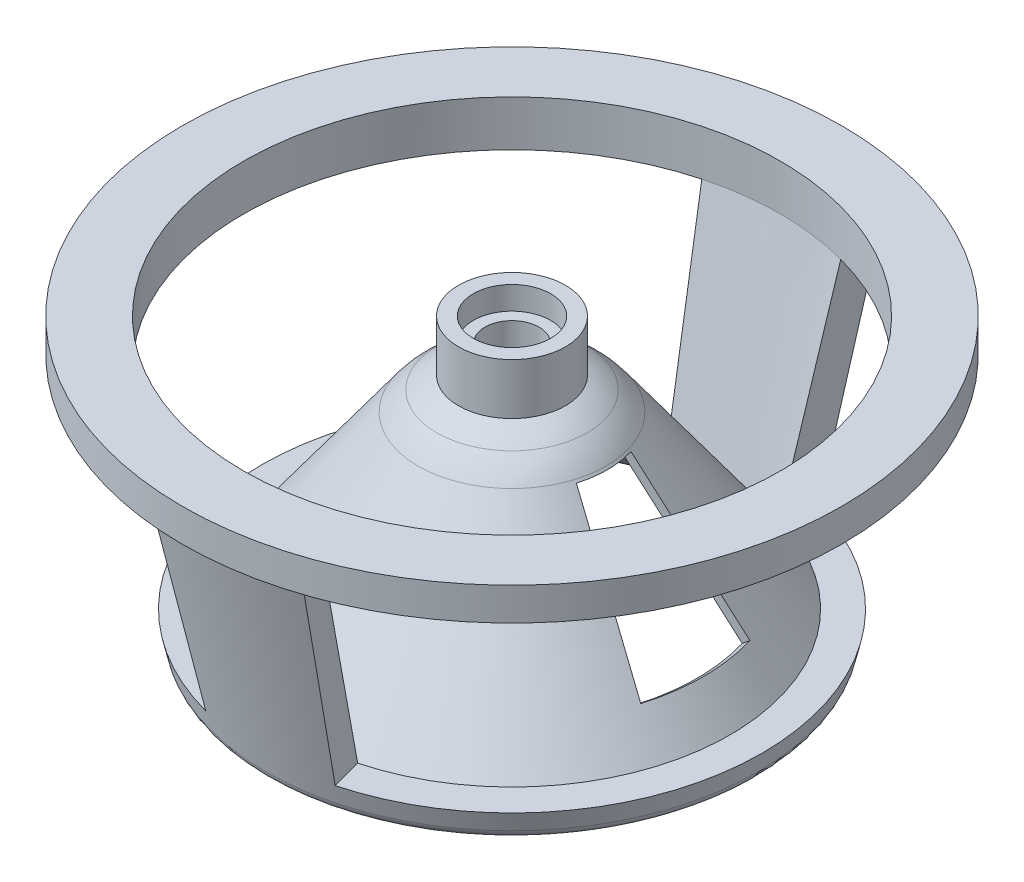
ISO-10303-21;
HEADER;
FILE_DESCRIPTION(('STEP AP214'),'2;1');
FILE_NAME('part.step','',(''),(''),'','','');
FILE_SCHEMA(('AUTOMOTIVE_DESIGN { 1 0 10303 214 1 1 1 1 }'));
ENDSEC;
DATA;
#1=APPLICATION_CONTEXT('core data for automotive mechanical design processes');
#2=APPLICATION_PROTOCOL_DEFINITION('international standard','automotive_design',2000,#1);
#3=PRODUCT_CONTEXT('',#1,'mechanical');
#4=PRODUCT('Part','Part','',(#3));
#5=PRODUCT_RELATED_PRODUCT_CATEGORY('part','',(#4));
#6=PRODUCT_DEFINITION_FORMATION('','',#4);
#7=PRODUCT_DEFINITION_CONTEXT('part definition',#1,'design');
#8=PRODUCT_DEFINITION('design','',#6,#7);
#9=PRODUCT_DEFINITION_SHAPE('','',#8);
#10=(LENGTH_UNIT() NAMED_UNIT(*) SI_UNIT(.MILLI.,.METRE.));
#11=(NAMED_UNIT(*) PLANE_ANGLE_UNIT() SI_UNIT($,.RADIAN.));
#12=(NAMED_UNIT(*) SI_UNIT($,.STERADIAN.) SOLID_ANGLE_UNIT());
#13=UNCERTAINTY_MEASURE_WITH_UNIT(LENGTH_MEASURE(1.E-05),#10,'distance_accuracy_value','');
#14=(GEOMETRIC_REPRESENTATION_CONTEXT(3) GLOBAL_UNCERTAINTY_ASSIGNED_CONTEXT((#13)) GLOBAL_UNIT_ASSIGNED_CONTEXT((#10,
#11,#12)) REPRESENTATION_CONTEXT('',''));
#15=CARTESIAN_POINT('',(0.,0.,0.));
#16=DIRECTION('',(0.,0.,1.));
#17=DIRECTION('',(1.,0.,0.));
#18=AXIS2_PLACEMENT_3D('',#15,#16,#17);
#19=CARTESIAN_POINT('',(0.,26.0591142770769,0.));
#20=DIRECTION('',(0.,-1.,0.));
#21=DIRECTION('',(0.,0.,-1.));
#22=AXIS2_PLACEMENT_3D('',#19,#20,#21);
#23=PLANE('',#22);
#24=CARTESIAN_POINT('',(0.,26.0591142770769,0.));
#25=DIRECTION('',(0.,-1.,0.));
#26=DIRECTION('',(0.,0.,-1.));
#27=AXIS2_PLACEMENT_3D('',#24,#25,#26);
#28=CIRCLE('',#27,19.4320296807066);
#29=CARTESIAN_POINT('',(0.,26.0591142770769,-19.4320296807066));
#30=VERTEX_POINT('',#29);
#31=EDGE_CURVE('E51',#30,#30,#28,.T.);
#32=ORIENTED_EDGE('',*,*,#31,.F.);
#33=EDGE_LOOP('',(#32));
#34=FACE_BOUND('',#33,.T.);
#35=CARTESIAN_POINT('',(0.,26.0591142770769,0.));
#36=DIRECTION('',(0.,-1.,0.));
#37=DIRECTION('',(0.,0.,-1.));
#38=AXIS2_PLACEMENT_3D('',#35,#36,#37);
#39=CIRCLE('',#38,15.8547006519023);
#40=CARTESIAN_POINT('',(0.,26.0591142770769,-15.8547006519023));
#41=VERTEX_POINT('',#40);
#42=EDGE_CURVE('E12',#41,#41,#39,.F.);
#43=ORIENTED_EDGE('',*,*,#42,.F.);
#44=EDGE_LOOP('',(#43));
#45=FACE_BOUND('',#44,.T.);
#46=ADVANCED_FACE('F44',(#34,#45),#23,.F.);
#47=CARTESIAN_POINT('',(0.,0.,0.));
#48=DIRECTION('',(-0.285353832322225,0.,0.958422240131676));
#49=DIRECTION('',(0.958422240131676,0.,0.285353832322225));
#50=AXIS2_PLACEMENT_3D('',#47,#48,#49);
#51=PLANE('',#50);
#52=DIRECTION('',(-0.563920510643963,-0.808581488677596,-0.16789768861713));
#53=VECTOR('',#52,1.);
#54=CARTESIAN_POINT('',(-23.7031683224097,20.4699127687572,-7.05721302757865));
#55=LINE('',#54,#53);
#56=CARTESIAN_POINT('',(-23.7031683224097,20.4699127687572,-7.05721302757865));
#57=VERTEX_POINT('',#56);
#58=CARTESIAN_POINT('',(-47.3878297694561,-13.4905097557019,-14.1089159494981));
#59=VERTEX_POINT('',#58);
#60=EDGE_CURVE('E260',#57,#59,#55,.T.);
#61=ORIENTED_EDGE('',*,*,#60,.T.);
#62=DIRECTION('',(0.774962481707387,-0.588384207952527,0.230731826538962));
#63=VECTOR('',#62,1.);
#64=CARTESIAN_POINT('',(-47.3878297694561,-13.4905097557019,-14.1089159494981));
#65=LINE('',#64,#63);
#66=CARTESIAN_POINT('',(-45.8379048060413,-14.6672781716069,-13.6474522964202));
#67=VERTEX_POINT('',#66);
#68=EDGE_CURVE('E262',#59,#67,#65,.T.);
#69=ORIENTED_EDGE('',*,*,#68,.T.);
#70=DIRECTION('',(0.563920510643963,0.808581488677596,0.16789768861713));
#71=VECTOR('',#70,1.);
#72=CARTESIAN_POINT('',(-22.1532433589949,19.2931443528521,-6.59574937450073));
#73=LINE('',#72,#71);
#74=CARTESIAN_POINT('',(-22.1532433589949,19.2931443528521,-6.59574937450073));
#75=VERTEX_POINT('',#74);
#76=EDGE_CURVE('E264',#67,#75,#73,.T.);
#77=ORIENTED_EDGE('',*,*,#76,.T.);
#78=DIRECTION('',(-0.77496248170738,0.588384207952536,-0.23073182653896));
#79=VECTOR('',#78,1.);
#80=CARTESIAN_POINT('',(-23.7031683224097,20.4699127687572,-7.05721302757865));
#81=LINE('',#80,#79);
#82=EDGE_CURVE('E266',#75,#57,#81,.T.);
#83=ORIENTED_EDGE('',*,*,#82,.T.);
#84=EDGE_LOOP('',(#61,#69,#77,#83));
#85=FACE_BOUND('',#84,.T.);
#86=ADVANCED_FACE('F315',(#85),#51,.T.);
#87=CARTESIAN_POINT('',(0.,-13.4905097557019,0.));
#88=DIRECTION('',(0.,1.,0.));
#89=DIRECTION('',(0.,0.,1.));
#90=AXIS2_PLACEMENT_3D('',#87,#88,#89);
#91=CONICAL_SURFACE('',#90,49.4435831987221,0.941737246875197);
#92=CARTESIAN_POINT('',(0.,-14.6672781716069,0.));
#93=DIRECTION('',(0.,-1.,0.));
#94=DIRECTION('',(0.,0.,-1.));
#95=AXIS2_PLACEMENT_3D('',#92,#93,#94);
#96=CIRCLE('',#95,47.8264202213669);
#97=CARTESIAN_POINT('',(-45.8379048060414,-14.6672781716069,13.6474522964202));
#98=VERTEX_POINT('',#97);
#99=EDGE_CURVE('E285',#98,#67,#96,.T.);
#100=ORIENTED_EDGE('',*,*,#99,.T.);
#101=ORIENTED_EDGE('',*,*,#68,.F.);
#102=CARTESIAN_POINT('',(0.,-13.4905097557019,0.));
#103=DIRECTION('',(0.,-1.,0.));
#104=DIRECTION('',(0.,0.,-1.));
#105=AXIS2_PLACEMENT_3D('',#102,#103,#104);
#106=CIRCLE('',#105,49.4435831987221);
#107=CARTESIAN_POINT('',(-47.3878297694561,-13.4905097557019,14.1089159494981));
#108=VERTEX_POINT('',#107);
#109=EDGE_CURVE('E288',#108,#59,#106,.T.);
#110=ORIENTED_EDGE('',*,*,#109,.F.);
#111=DIRECTION('',(0.774962481707387,-0.588384207952527,-0.230731826538962));
#112=VECTOR('',#111,1.);
#113=CARTESIAN_POINT('',(-47.3878297694561,-13.4905097557019,14.1089159494981));
#114=LINE('',#113,#112);
#115=EDGE_CURVE('E271',#108,#98,#114,.T.);
#116=ORIENTED_EDGE('',*,*,#115,.T.);
#117=EDGE_LOOP('',(#100,#101,#110,#116));
#118=FACE_BOUND('',#117,.T.);
#119=ADVANCED_FACE('F358',(#118),#91,.F.);
#120=CARTESIAN_POINT('',(0.,0.,0.));
#121=DIRECTION('',(0.285353832322225,0.,0.958422240131676));
#122=DIRECTION('',(0.958422240131676,0.,-0.285353832322225));
#123=AXIS2_PLACEMENT_3D('',#120,#121,#122);
#124=PLANE('',#123);
#125=DIRECTION('',(-0.563920510643963,-0.808581488677596,0.167897688617131));
#126=VECTOR('',#125,1.);
#127=CARTESIAN_POINT('',(-23.7031683224097,20.4699127687572,7.05721302757865));
#128=LINE('',#127,#126);
#129=CARTESIAN_POINT('',(-23.7031683224097,20.4699127687572,7.05721302757865));
#130=VERTEX_POINT('',#129);
#131=EDGE_CURVE('E268',#130,#108,#128,.T.);
#132=ORIENTED_EDGE('',*,*,#131,.F.);
#133=DIRECTION('',(-0.774962481707381,0.588384207952536,0.23073182653896));
#134=VECTOR('',#133,1.);
#135=CARTESIAN_POINT('',(-23.7031683224097,20.4699127687572,7.05721302757865));
#136=LINE('',#135,#134);
#137=CARTESIAN_POINT('',(-22.1532433589949,19.2931443528521,6.59574937450073));
#138=VERTEX_POINT('',#137);
#139=EDGE_CURVE('E276',#138,#130,#136,.T.);
#140=ORIENTED_EDGE('',*,*,#139,.F.);
#141=DIRECTION('',(0.563920510643963,0.808581488677596,-0.167897688617131));
#142=VECTOR('',#141,1.);
#143=CARTESIAN_POINT('',(-22.1532433589949,19.2931443528521,6.59574937450073));
#144=LINE('',#143,#142);
#145=EDGE_CURVE('E273',#98,#138,#144,.T.);
#146=ORIENTED_EDGE('',*,*,#145,.F.);
#147=ORIENTED_EDGE('',*,*,#115,.F.);
#148=EDGE_LOOP('',(#132,#140,#146,#147));
#149=FACE_BOUND('',#148,.T.);
#150=ADVANCED_FACE('F361',(#149),#124,.F.);
#151=CARTESIAN_POINT('',(0.,19.2931443528521,0.));
#152=DIRECTION('',(0.,1.,0.));
#153=DIRECTION('',(0.,0.,1.));
#154=AXIS2_PLACEMENT_3D('',#151,#152,#153);
#155=CONICAL_SURFACE('',#154,23.1142834873608,0.941737246875186);
#156=ORIENTED_EDGE('',*,*,#139,.T.);
#157=CARTESIAN_POINT('',(0.,20.4699127687572,0.));
#158=DIRECTION('',(0.,-1.,0.));
#159=DIRECTION('',(0.,0.,-1.));
#160=AXIS2_PLACEMENT_3D('',#157,#158,#159);
#161=CIRCLE('',#160,24.731446464716);
#162=EDGE_CURVE('E279',#130,#57,#161,.T.);
#163=ORIENTED_EDGE('',*,*,#162,.T.);
#164=ORIENTED_EDGE('',*,*,#82,.F.);
#165=CARTESIAN_POINT('',(0.,19.2931443528521,0.));
#166=DIRECTION('',(0.,-1.,0.));
#167=DIRECTION('',(0.,0.,-1.));
#168=AXIS2_PLACEMENT_3D('',#165,#166,#167);
#169=CIRCLE('',#168,23.1142834873608);
#170=EDGE_CURVE('E282',#138,#75,#169,.T.);
#171=ORIENTED_EDGE('',*,*,#170,.F.);
#172=EDGE_LOOP('',(#156,#163,#164,#171));
#173=FACE_BOUND('',#172,.T.);
#174=ADVANCED_FACE('F363',(#173),#155,.T.);
#175=CARTESIAN_POINT('',(0.,0.,0.));
#176=DIRECTION('',(0.285353832322225,0.,-0.958422240131676));
#177=DIRECTION('',(-0.958422240131676,0.,-0.285353832322225));
#178=AXIS2_PLACEMENT_3D('',#175,#176,#177);
#179=PLANE('',#178);
#180=DIRECTION('',(0.563920510643963,-0.808581488677596,0.16789768861713));
#181=VECTOR('',#180,1.);
#182=CARTESIAN_POINT('',(23.7031683224097,20.4699127687572,7.05721302757865));
#183=LINE('',#182,#181);
#184=CARTESIAN_POINT('',(23.7031683224097,20.4699127687572,7.05721302757865));
#185=VERTEX_POINT('',#184);
#186=CARTESIAN_POINT('',(47.3878297694561,-13.4905097557019,14.1089159494981));
#187=VERTEX_POINT('',#186);
#188=EDGE_CURVE('E229',#185,#187,#183,.T.);
#189=ORIENTED_EDGE('',*,*,#188,.T.);
#190=DIRECTION('',(-0.774962481707387,-0.588384207952527,-0.230731826538962));
#191=VECTOR('',#190,1.);
#192=CARTESIAN_POINT('',(47.3878297694561,-13.4905097557019,14.1089159494981));
#193=LINE('',#192,#191);
#194=CARTESIAN_POINT('',(45.8379048060413,-14.6672781716069,13.6474522964202));
#195=VERTEX_POINT('',#194);
#196=EDGE_CURVE('E231',#187,#195,#193,.T.);
#197=ORIENTED_EDGE('',*,*,#196,.T.);
#198=DIRECTION('',(-0.563920510643963,0.808581488677596,-0.16789768861713));
#199=VECTOR('',#198,1.);
#200=CARTESIAN_POINT('',(22.1532433589949,19.2931443528521,6.59574937450073));
#201=LINE('',#200,#199);
#202=CARTESIAN_POINT('',(22.1532433589949,19.2931443528521,6.59574937450073));
#203=VERTEX_POINT('',#202);
#204=EDGE_CURVE('E233',#195,#203,#201,.T.);
#205=ORIENTED_EDGE('',*,*,#204,.T.);
#206=DIRECTION('',(0.77496248170738,0.588384207952536,0.23073182653896));
#207=VECTOR('',#206,1.);
#208=CARTESIAN_POINT('',(23.7031683224097,20.4699127687572,7.05721302757865));
#209=LINE('',#208,#207);
#210=EDGE_CURVE('E235',#203,#185,#209,.T.);
#211=ORIENTED_EDGE('',*,*,#210,.T.);
#212=EDGE_LOOP('',(#189,#197,#205,#211));
#213=FACE_BOUND('',#212,.T.);
#214=ADVANCED_FACE('F366',(#213),#179,.T.);
#215=CARTESIAN_POINT('',(0.,-13.4905097557019,0.));
#216=DIRECTION('',(0.,1.,0.));
#217=DIRECTION('',(0.,0.,-1.));
#218=AXIS2_PLACEMENT_3D('',#215,#216,#217);
#219=CONICAL_SURFACE('',#218,49.4435831987221,0.941737246875197);
#220=CARTESIAN_POINT('',(0.,-14.6672781716069,0.));
#221=DIRECTION('',(0.,-1.,0.));
#222=DIRECTION('',(0.,0.,1.));
#223=AXIS2_PLACEMENT_3D('',#220,#221,#222);
#224=CIRCLE('',#223,47.8264202213669);
#225=CARTESIAN_POINT('',(45.8379048060414,-14.6672781716069,-13.6474522964202));
#226=VERTEX_POINT('',#225);
#227=EDGE_CURVE('E254',#226,#195,#224,.T.);
#228=ORIENTED_EDGE('',*,*,#227,.T.);
#229=ORIENTED_EDGE('',*,*,#196,.F.);
#230=CARTESIAN_POINT('',(0.,-13.4905097557019,0.));
#231=DIRECTION('',(0.,-1.,0.));
#232=DIRECTION('',(0.,0.,1.));
#233=AXIS2_PLACEMENT_3D('',#230,#231,#232);
#234=CIRCLE('',#233,49.4435831987221);
#235=CARTESIAN_POINT('',(47.3878297694561,-13.4905097557019,-14.1089159494981));
#236=VERTEX_POINT('',#235);
#237=EDGE_CURVE('E257',#236,#187,#234,.T.);
#238=ORIENTED_EDGE('',*,*,#237,.F.);
#239=DIRECTION('',(-0.774962481707387,-0.588384207952527,0.230731826538962));
#240=VECTOR('',#239,1.);
#241=CARTESIAN_POINT('',(47.3878297694561,-13.4905097557019,-14.1089159494981));
#242=LINE('',#241,#240);
#243=EDGE_CURVE('E240',#236,#226,#242,.T.);
#244=ORIENTED_EDGE('',*,*,#243,.T.);
#245=EDGE_LOOP('',(#228,#229,#238,#244));
#246=FACE_BOUND('',#245,.T.);
#247=ADVANCED_FACE('F374',(#246),#219,.F.);
#248=CARTESIAN_POINT('',(0.,0.,0.));
#249=DIRECTION('',(-0.285353832322225,0.,-0.958422240131676));
#250=DIRECTION('',(-0.958422240131676,0.,0.285353832322225));
#251=AXIS2_PLACEMENT_3D('',#248,#249,#250);
#252=PLANE('',#251);
#253=DIRECTION('',(0.563920510643963,-0.808581488677596,-0.167897688617131));
#254=VECTOR('',#253,1.);
#255=CARTESIAN_POINT('',(23.7031683224097,20.4699127687572,-7.05721302757865));
#256=LINE('',#255,#254);
#257=CARTESIAN_POINT('',(23.7031683224097,20.4699127687572,-7.05721302757865));
#258=VERTEX_POINT('',#257);
#259=EDGE_CURVE('E237',#258,#236,#256,.T.);
#260=ORIENTED_EDGE('',*,*,#259,.F.);
#261=DIRECTION('',(0.774962481707381,0.588384207952536,-0.23073182653896));
#262=VECTOR('',#261,1.);
#263=CARTESIAN_POINT('',(23.7031683224097,20.4699127687572,-7.05721302757865));
#264=LINE('',#263,#262);
#265=CARTESIAN_POINT('',(22.1532433589949,19.2931443528521,-6.59574937450073));
#266=VERTEX_POINT('',#265);
#267=EDGE_CURVE('E245',#266,#258,#264,.T.);
#268=ORIENTED_EDGE('',*,*,#267,.F.);
#269=DIRECTION('',(-0.563920510643963,0.808581488677596,0.167897688617131));
#270=VECTOR('',#269,1.);
#271=CARTESIAN_POINT('',(22.1532433589949,19.2931443528521,-6.59574937450073));
#272=LINE('',#271,#270);
#273=EDGE_CURVE('E242',#226,#266,#272,.T.);
#274=ORIENTED_EDGE('',*,*,#273,.F.);
#275=ORIENTED_EDGE('',*,*,#243,.F.);
#276=EDGE_LOOP('',(#260,#268,#274,#275));
#277=FACE_BOUND('',#276,.T.);
#278=ADVANCED_FACE('F377',(#277),#252,.F.);
#279=CARTESIAN_POINT('',(0.,19.2931443528521,0.));
#280=DIRECTION('',(0.,1.,0.));
#281=DIRECTION('',(0.,0.,-1.));
#282=AXIS2_PLACEMENT_3D('',#279,#280,#281);
#283=CONICAL_SURFACE('',#282,23.1142834873608,0.941737246875186);
#284=ORIENTED_EDGE('',*,*,#267,.T.);
#285=CARTESIAN_POINT('',(0.,20.4699127687572,0.));
#286=DIRECTION('',(0.,-1.,0.));
#287=DIRECTION('',(0.,0.,1.));
#288=AXIS2_PLACEMENT_3D('',#285,#286,#287);
#289=CIRCLE('',#288,24.731446464716);
#290=EDGE_CURVE('E248',#258,#185,#289,.T.);
#291=ORIENTED_EDGE('',*,*,#290,.T.);
#292=ORIENTED_EDGE('',*,*,#210,.F.);
#293=CARTESIAN_POINT('',(0.,19.2931443528521,0.));
#294=DIRECTION('',(0.,-1.,0.));
#295=DIRECTION('',(0.,0.,1.));
#296=AXIS2_PLACEMENT_3D('',#293,#294,#295);
#297=CIRCLE('',#296,23.1142834873608);
#298=EDGE_CURVE('E251',#266,#203,#297,.T.);
#299=ORIENTED_EDGE('',*,*,#298,.F.);
#300=EDGE_LOOP('',(#284,#291,#292,#299));
#301=FACE_BOUND('',#300,.T.);
#302=ADVANCED_FACE('F341',(#301),#283,.T.);
#303=CARTESIAN_POINT('',(0.,-27.1250492876658,0.));
#304=DIRECTION('',(0.,1.,0.));
#305=DIRECTION('',(-0.010442725131449,0.,0.999945473259332));
#306=AXIS2_PLACEMENT_3D('',#303,#304,#305);
#307=TOROIDAL_SURFACE('',#306,60.6018249710729,3.00000000000001);
#308=CARTESIAN_POINT('',(0.,-27.791315789317,0.));
#309=DIRECTION('',(0.,1.,0.));
#310=DIRECTION('',(-0.010442725131449,0.,0.999945473259332));
#311=AXIS2_PLACEMENT_3D('',#308,#309,#310);
#312=CIRCLE('',#311,63.5269042774811);
#313=CARTESIAN_POINT('',(-0.663393999821614,-27.791315789317,63.5234403624462));
#314=VERTEX_POINT('',#313);
#315=EDGE_CURVE('E298',#314,#314,#312,.T.);
#316=ORIENTED_EDGE('',*,*,#315,.F.);
#317=EDGE_LOOP('',(#316));
#318=FACE_BOUND('',#317,.T.);
#319=CARTESIAN_POINT('',(0.,-28.8902019115234,0.));
#320=DIRECTION('',(0.,1.,0.));
#321=DIRECTION('',(-0.010442725131449,0.,0.999945473259332));
#322=AXIS2_PLACEMENT_3D('',#319,#320,#321);
#323=CIRCLE('',#322,58.1760805050401);
#324=CARTESIAN_POINT('',(-0.607516817939189,-28.8902019115234,58.1729083529854));
#325=VERTEX_POINT('',#324);
#326=EDGE_CURVE('E302',#325,#325,#323,.T.);
#327=ORIENTED_EDGE('',*,*,#326,.T.);
#328=EDGE_LOOP('',(#327));
#329=FACE_BOUND('',#328,.T.);
#330=ADVANCED_FACE('F337',(#318,#329),#307,.T.);
#331=CARTESIAN_POINT('',(0.,-23.0430548582666,0.));
#332=DIRECTION('',(0.,-1.,0.));
#333=DIRECTION('',(0.,0.,-1.));
#334=AXIS2_PLACEMENT_3D('',#331,#332,#333);
#335=CONICAL_SURFACE('',#334,56.3947275951831,0.629059079919699);
#336=ORIENTED_EDGE('',*,*,#290,.F.);
#337=ORIENTED_EDGE('',*,*,#259,.T.);
#338=ORIENTED_EDGE('',*,*,#237,.T.);
#339=ORIENTED_EDGE('',*,*,#188,.F.);
#340=EDGE_LOOP('',(#336,#337,#338,#339));
#341=FACE_BOUND('',#340,.T.);
#342=ORIENTED_EDGE('',*,*,#162,.F.);
#343=ORIENTED_EDGE('',*,*,#131,.T.);
#344=ORIENTED_EDGE('',*,*,#109,.T.);
#345=ORIENTED_EDGE('',*,*,#60,.F.);
#346=EDGE_LOOP('',(#342,#343,#344,#345));
#347=FACE_BOUND('',#346,.T.);
#348=CARTESIAN_POINT('',(0.,21.0591142770769,0.));
#349=DIRECTION('',(0.,1.,0.));
#350=DIRECTION('',(0.,0.,1.));
#351=AXIS2_PLACEMENT_3D('',#348,#349,#350);
#352=CIRCLE('',#351,24.3026994952991);
#353=CARTESIAN_POINT('',(0.,21.0591142770769,24.3026994952991));
#354=VERTEX_POINT('',#353);
#355=EDGE_CURVE('E291',#354,#354,#352,.T.);
#356=ORIENTED_EDGE('',*,*,#355,.F.);
#357=EDGE_LOOP('',(#356));
#358=FACE_BOUND('',#357,.T.);
#359=CARTESIAN_POINT('',(0.,-23.0430548582666,0.));
#360=DIRECTION('',(0.,1.,0.));
#361=DIRECTION('',(0.,0.,1.));
#362=AXIS2_PLACEMENT_3D('',#359,#360,#361);
#363=CIRCLE('',#362,56.3947275951831);
#364=CARTESIAN_POINT('',(-14.5960295450019,-23.0430548582666,-54.4731238507242));
#365=VERTEX_POINT('',#364);
#366=CARTESIAN_POINT('',(-14.5960295450019,-23.0430548582666,54.4731238507242));
#367=VERTEX_POINT('',#366);
#368=EDGE_CURVE('E295',#365,#367,#363,.T.);
#369=ORIENTED_EDGE('',*,*,#368,.T.);
#370=CARTESIAN_POINT('',(14.5960295450019,-23.0430548582666,54.4731238507242));
#371=VERTEX_POINT('',#370);
#372=EDGE_CURVE('E299',#367,#371,#363,.T.);
#373=ORIENTED_EDGE('',*,*,#372,.T.);
#374=CARTESIAN_POINT('',(0.,-23.0430548582666,0.));
#375=DIRECTION('',(0.,-1.,0.));
#376=DIRECTION('',(0.,0.,1.));
#377=AXIS2_PLACEMENT_3D('',#374,#375,#376);
#378=CIRCLE('',#377,56.3947275951831);
#379=CARTESIAN_POINT('',(14.5960295450019,-23.0430548582666,-54.4731238507242));
#380=VERTEX_POINT('',#379);
#381=EDGE_CURVE('E212',#380,#371,#378,.T.);
#382=ORIENTED_EDGE('',*,*,#381,.F.);
#383=EDGE_CURVE('E294',#380,#365,#363,.T.);
#384=ORIENTED_EDGE('',*,*,#383,.T.);
#385=EDGE_LOOP('',(#369,#373,#382,#384));
#386=FACE_BOUND('',#385,.T.);
#387=ADVANCED_FACE('F340',(#341,#347,#358,#386),#335,.T.);
#388=CARTESIAN_POINT('',(0.,6.67345768639848,0.));
#389=DIRECTION('',(0.,1.,0.));
#390=DIRECTION('',(0.,0.,1.));
#391=AXIS2_PLACEMENT_3D('',#388,#389,#390);
#392=DEGENERATE_TOROIDAL_SURFACE('',#391,4.5333456199246,24.4494267457279,.T.);
#393=ORIENTED_EDGE('',*,*,#31,.T.);
#394=EDGE_LOOP('',(#393));
#395=FACE_BOUND('',#394,.T.);
#396=ORIENTED_EDGE('',*,*,#355,.T.);
#397=EDGE_LOOP('',(#396));
#398=FACE_BOUND('',#397,.T.);
#399=ADVANCED_FACE('F310',(#395,#398),#392,.T.);
#400=CARTESIAN_POINT('',(-14.5960295450019,-23.0430548582666,54.4731238507242));
#401=DIRECTION('',(0.,1.,0.));
#402=DIRECTION('',(0.,0.,1.));
#403=AXIS2_PLACEMENT_3D('',#400,#401,#402);
#404=PLANE('',#403);
#405=ORIENTED_EDGE('',*,*,#368,.F.);
#406=DIRECTION('',(0.258819045102518,0.,0.965925826289069));
#407=VECTOR('',#406,1.);
#408=CARTESIAN_POINT('',(-14.5960295450019,-23.0430548582666,-54.4731238507242));
#409=LINE('',#408,#407);
#410=CARTESIAN_POINT('',(-16.7218973511517,-23.0430548582667,-62.4069705134504));
#411=VERTEX_POINT('',#410);
#412=EDGE_CURVE('E217',#411,#365,#409,.T.);
#413=ORIENTED_EDGE('',*,*,#412,.F.);
#414=CARTESIAN_POINT('',(0.,-23.0430548582666,0.));
#415=DIRECTION('',(0.,-1.,0.));
#416=DIRECTION('',(0.,0.,-1.));
#417=AXIS2_PLACEMENT_3D('',#414,#415,#416);
#418=CIRCLE('',#417,64.6084500641296);
#419=CARTESIAN_POINT('',(-16.7218973511517,-23.0430548582666,62.4069705134504));
#420=VERTEX_POINT('',#419);
#421=EDGE_CURVE('E227',#420,#411,#418,.T.);
#422=ORIENTED_EDGE('',*,*,#421,.F.);
#423=DIRECTION('',(0.258819045102518,0.,-0.965925826289069));
#424=VECTOR('',#423,1.);
#425=CARTESIAN_POINT('',(-14.5960295450019,-23.0430548582666,54.4731238507242));
#426=LINE('',#425,#424);
#427=EDGE_CURVE('E224',#420,#367,#426,.T.);
#428=ORIENTED_EDGE('',*,*,#427,.T.);
#429=EDGE_LOOP('',(#405,#413,#422,#428));
#430=FACE_BOUND('',#429,.T.);
#431=ADVANCED_FACE('F351',(#430),#404,.T.);
#432=CARTESIAN_POINT('',(0.,30.6647699152248,0.));
#433=DIRECTION('',(0.,1.,0.));
#434=DIRECTION('',(0.,0.,1.));
#435=AXIS2_PLACEMENT_3D('',#432,#433,#434);
#436=CONICAL_SURFACE('',#435,69.3650095965407,0.236960028630021);
#437=DIRECTION('',(0.060757432557784,0.97205609464743,-0.226749825243092));
#438=VECTOR('',#437,1.);
#439=CARTESIAN_POINT('',(17.9529855473037,30.6647699152248,-67.0014542100878));
#440=LINE('',#439,#438);
#441=CARTESIAN_POINT('',(17.9529855473037,30.6647699152248,-67.0014542100878));
#442=VERTEX_POINT('',#441);
#443=EDGE_CURVE('E58',#380,#442,#440,.T.);
#444=ORIENTED_EDGE('',*,*,#443,.T.);
#445=CARTESIAN_POINT('',(0.,30.6647699152248,0.));
#446=DIRECTION('',(0.,1.,0.));
#447=DIRECTION('',(0.,0.,1.));
#448=AXIS2_PLACEMENT_3D('',#445,#446,#447);
#449=CIRCLE('',#448,69.3650095965407);
#450=CARTESIAN_POINT('',(-17.9529855473037,30.6647699152248,-67.0014542100878));
#451=VERTEX_POINT('',#450);
#452=EDGE_CURVE('E444',#442,#451,#449,.T.);
#453=ORIENTED_EDGE('',*,*,#452,.T.);
#454=DIRECTION('',(-0.060757432557784,0.97205609464743,-0.226749825243092));
#455=VECTOR('',#454,1.);
#456=CARTESIAN_POINT('',(-17.9529855473037,30.6647699152248,-67.0014542100878));
#457=LINE('',#456,#455);
#458=EDGE_CURVE('E220',#365,#451,#457,.T.);
#459=ORIENTED_EDGE('',*,*,#458,.F.);
#460=ORIENTED_EDGE('',*,*,#383,.F.);
#461=EDGE_LOOP('',(#444,#453,#459,#460));
#462=FACE_BOUND('',#461,.T.);
#463=ADVANCED_FACE('F347',(#462),#436,.F.);
#464=DIRECTION('',(-0.060757432557784,0.97205609464743,0.226749825243092));
#465=VECTOR('',#464,1.);
#466=CARTESIAN_POINT('',(-17.9529855473037,30.6647699152248,67.0014542100878));
#467=LINE('',#466,#465);
#468=CARTESIAN_POINT('',(-17.9529855473037,30.6647699152248,67.0014542100878));
#469=VERTEX_POINT('',#468);
#470=EDGE_CURVE('E66',#367,#469,#467,.T.);
#471=ORIENTED_EDGE('',*,*,#470,.T.);
#472=CARTESIAN_POINT('',(17.9529855473037,30.6647699152248,67.0014542100878));
#473=VERTEX_POINT('',#472);
#474=EDGE_CURVE('E449',#469,#473,#449,.T.);
#475=ORIENTED_EDGE('',*,*,#474,.T.);
#476=DIRECTION('',(0.060757432557784,0.97205609464743,0.226749825243092));
#477=VECTOR('',#476,1.);
#478=CARTESIAN_POINT('',(17.9529855473037,30.6647699152248,67.0014542100878));
#479=LINE('',#478,#477);
#480=EDGE_CURVE('E165',#371,#473,#479,.T.);
#481=ORIENTED_EDGE('',*,*,#480,.F.);
#482=ORIENTED_EDGE('',*,*,#372,.F.);
#483=EDGE_LOOP('',(#471,#475,#481,#482));
#484=FACE_BOUND('',#483,.T.);
#485=ADVANCED_FACE('F350',(#484),#436,.F.);
#486=CARTESIAN_POINT('',(14.5960295450019,-23.0430548582666,-54.4731238507242));
#487=DIRECTION('',(0.,1.,0.));
#488=DIRECTION('',(0.,0.,-1.));
#489=AXIS2_PLACEMENT_3D('',#486,#487,#488);
#490=PLANE('',#489);
#491=ORIENTED_EDGE('',*,*,#381,.T.);
#492=DIRECTION('',(-0.258819045102518,0.,-0.965925826289069));
#493=VECTOR('',#492,1.);
#494=CARTESIAN_POINT('',(14.5960295450019,-23.0430548582666,54.4731238507242));
#495=LINE('',#494,#493);
#496=CARTESIAN_POINT('',(16.7218973511517,-23.0430548582667,62.4069705134504));
#497=VERTEX_POINT('',#496);
#498=EDGE_CURVE('E206',#497,#371,#495,.T.);
#499=ORIENTED_EDGE('',*,*,#498,.F.);
#500=CARTESIAN_POINT('',(0.,-23.0430548582666,0.));
#501=DIRECTION('',(0.,-1.,0.));
#502=DIRECTION('',(0.,0.,1.));
#503=AXIS2_PLACEMENT_3D('',#500,#501,#502);
#504=CIRCLE('',#503,64.6084500641296);
#505=CARTESIAN_POINT('',(16.7218973511517,-23.0430548582666,-62.4069705134504));
#506=VERTEX_POINT('',#505);
#507=EDGE_CURVE('E214',#506,#497,#504,.T.);
#508=ORIENTED_EDGE('',*,*,#507,.F.);
#509=DIRECTION('',(-0.258819045102518,0.,0.965925826289069));
#510=VECTOR('',#509,1.);
#511=CARTESIAN_POINT('',(14.5960295450019,-23.0430548582666,-54.4731238507242));
#512=LINE('',#511,#510);
#513=EDGE_CURVE('E160',#506,#380,#512,.T.);
#514=ORIENTED_EDGE('',*,*,#513,.T.);
#515=EDGE_LOOP('',(#491,#499,#508,#514));
#516=FACE_BOUND('',#515,.T.);
#517=ADVANCED_FACE('F346',(#516),#490,.T.);
#518=CARTESIAN_POINT('',(0.,-27.791315789317,0.));
#519=DIRECTION('',(0.,1.,0.));
#520=DIRECTION('',(-0.010442725131449,0.,0.999945473259332));
#521=AXIS2_PLACEMENT_3D('',#518,#519,#520);
#522=CONICAL_SURFACE('',#521,63.5269042774811,0.223956285326343);
#523=DIRECTION('',(-0.0574808199137248,-0.975026435469395,-0.21452134037874));
#524=VECTOR('',#523,1.);
#525=CARTESIAN_POINT('',(16.7218973511517,-23.0430548582667,62.4069705134504));
#526=LINE('',#525,#524);
#527=CARTESIAN_POINT('',(19.8881395077316,30.6647699152248,74.2235471108729));
#528=VERTEX_POINT('',#527);
#529=EDGE_CURVE('E204',#528,#497,#526,.T.);
#530=ORIENTED_EDGE('',*,*,#529,.F.);
#531=CARTESIAN_POINT('',(0.,30.6647699152248,0.));
#532=DIRECTION('',(0.,1.,0.));
#533=DIRECTION('',(-0.010442725131449,0.,0.999945473259332));
#534=AXIS2_PLACEMENT_3D('',#531,#532,#533);
#535=CIRCLE('',#534,76.8418703494323);
#536=CARTESIAN_POINT('',(-19.8881395077315,30.6647699152249,74.2235471108729));
#537=VERTEX_POINT('',#536);
#538=EDGE_CURVE('E189',#537,#528,#535,.T.);
#539=ORIENTED_EDGE('',*,*,#538,.F.);
#540=DIRECTION('',(0.0574808199137248,-0.975026435469395,-0.21452134037874));
#541=VECTOR('',#540,1.);
#542=CARTESIAN_POINT('',(-16.7218973511517,-23.0430548582666,62.4069705134504));
#543=LINE('',#542,#541);
#544=EDGE_CURVE('E222',#537,#420,#543,.T.);
#545=ORIENTED_EDGE('',*,*,#544,.T.);
#546=ORIENTED_EDGE('',*,*,#421,.T.);
#547=DIRECTION('',(0.0574808199137248,-0.975026435469395,0.21452134037874));
#548=VECTOR('',#547,1.);
#549=CARTESIAN_POINT('',(-16.7218973511517,-23.0430548582667,-62.4069705134504));
#550=LINE('',#549,#548);
#551=CARTESIAN_POINT('',(-19.8881395077316,30.6647699152248,-74.2235471108729));
#552=VERTEX_POINT('',#551);
#553=EDGE_CURVE('E184',#552,#411,#550,.T.);
#554=ORIENTED_EDGE('',*,*,#553,.F.);
#555=CARTESIAN_POINT('',(19.8881395077315,30.6647699152248,-74.2235471108729));
#556=VERTEX_POINT('',#555);
#557=EDGE_CURVE('E180',#556,#552,#535,.T.);
#558=ORIENTED_EDGE('',*,*,#557,.F.);
#559=DIRECTION('',(-0.0574808199137248,-0.975026435469395,0.21452134037874));
#560=VECTOR('',#559,1.);
#561=CARTESIAN_POINT('',(16.7218973511517,-23.0430548582666,-62.4069705134504));
#562=LINE('',#561,#560);
#563=EDGE_CURVE('E155',#556,#506,#562,.T.);
#564=ORIENTED_EDGE('',*,*,#563,.T.);
#565=ORIENTED_EDGE('',*,*,#507,.T.);
#566=EDGE_LOOP('',(#530,#539,#545,#546,#554,#558,#564,#565));
#567=FACE_BOUND('',#566,.T.);
#568=ORIENTED_EDGE('',*,*,#315,.T.);
#569=EDGE_LOOP('',(#568));
#570=FACE_BOUND('',#569,.T.);
#571=ADVANCED_FACE('F181',(#567,#570),#522,.T.);
#572=CARTESIAN_POINT('',(0.,0.,0.));
#573=DIRECTION('',(0.965925826289069,0.,-0.258819045102518));
#574=DIRECTION('',(-0.258819045102518,0.,-0.965925826289069));
#575=AXIS2_PLACEMENT_3D('',#572,#573,#574);
#576=PLANE('',#575);
#577=ORIENTED_EDGE('',*,*,#480,.T.);
#578=DIRECTION('',(0.258819045102518,0.,0.965925826289069));
#579=VECTOR('',#578,1.);
#580=CARTESIAN_POINT('',(19.8881395077316,30.6647699152248,74.2235471108729));
#581=LINE('',#580,#579);
#582=EDGE_CURVE('E177',#473,#528,#581,.T.);
#583=ORIENTED_EDGE('',*,*,#582,.T.);
#584=ORIENTED_EDGE('',*,*,#529,.T.);
#585=ORIENTED_EDGE('',*,*,#498,.T.);
#586=EDGE_LOOP('',(#577,#583,#584,#585));
#587=FACE_BOUND('',#586,.T.);
#588=ADVANCED_FACE('F345',(#587),#576,.T.);
#589=CARTESIAN_POINT('',(0.,0.,0.));
#590=DIRECTION('',(-0.965925826289069,0.,-0.258819045102518));
#591=DIRECTION('',(-0.258819045102518,0.,0.965925826289069));
#592=AXIS2_PLACEMENT_3D('',#589,#590,#591);
#593=PLANE('',#592);
#594=ORIENTED_EDGE('',*,*,#563,.F.);
#595=DIRECTION('',(0.258819045102518,0.,-0.965925826289069));
#596=VECTOR('',#595,1.);
#597=CARTESIAN_POINT('',(19.8881395077316,30.6647699152248,-74.2235471108729));
#598=LINE('',#597,#596);
#599=EDGE_CURVE('E158',#442,#556,#598,.T.);
#600=ORIENTED_EDGE('',*,*,#599,.F.);
#601=ORIENTED_EDGE('',*,*,#443,.F.);
#602=ORIENTED_EDGE('',*,*,#513,.F.);
#603=EDGE_LOOP('',(#594,#600,#601,#602));
#604=FACE_BOUND('',#603,.T.);
#605=ADVANCED_FACE('F157',(#604),#593,.F.);
#606=CARTESIAN_POINT('',(0.,0.,0.));
#607=DIRECTION('',(-0.965925826289069,0.,0.258819045102518));
#608=DIRECTION('',(0.258819045102518,0.,0.965925826289069));
#609=AXIS2_PLACEMENT_3D('',#606,#607,#608);
#610=PLANE('',#609);
#611=ORIENTED_EDGE('',*,*,#458,.T.);
#612=DIRECTION('',(-0.258819045102518,0.,-0.965925826289069));
#613=VECTOR('',#612,1.);
#614=CARTESIAN_POINT('',(-19.8881395077316,30.6647699152248,-74.2235471108729));
#615=LINE('',#614,#613);
#616=EDGE_CURVE('E195',#451,#552,#615,.T.);
#617=ORIENTED_EDGE('',*,*,#616,.T.);
#618=ORIENTED_EDGE('',*,*,#553,.T.);
#619=ORIENTED_EDGE('',*,*,#412,.T.);
#620=EDGE_LOOP('',(#611,#617,#618,#619));
#621=FACE_BOUND('',#620,.T.);
#622=ADVANCED_FACE('F332',(#621),#610,.T.);
#623=CARTESIAN_POINT('',(0.,0.,0.));
#624=DIRECTION('',(0.965925826289069,0.,0.258819045102518));
#625=DIRECTION('',(0.258819045102518,0.,-0.965925826289069));
#626=AXIS2_PLACEMENT_3D('',#623,#624,#625);
#627=PLANE('',#626);
#628=ORIENTED_EDGE('',*,*,#544,.F.);
#629=DIRECTION('',(-0.258819045102518,0.,0.965925826289069));
#630=VECTOR('',#629,1.);
#631=CARTESIAN_POINT('',(-19.8881395077316,30.6647699152248,74.2235471108729));
#632=LINE('',#631,#630);
#633=EDGE_CURVE('E199',#469,#537,#632,.T.);
#634=ORIENTED_EDGE('',*,*,#633,.F.);
#635=ORIENTED_EDGE('',*,*,#470,.F.);
#636=ORIENTED_EDGE('',*,*,#427,.F.);
#637=EDGE_LOOP('',(#628,#634,#635,#636));
#638=FACE_BOUND('',#637,.T.);
#639=ADVANCED_FACE('F326',(#638),#627,.F.);
#640=CARTESIAN_POINT('',(0.,19.8823458611719,0.));
#641=DIRECTION('',(0.,-1.,0.));
#642=DIRECTION('',(0.010442725131449,0.,-0.999945473259332));
#643=AXIS2_PLACEMENT_3D('',#640,#641,#642);
#644=CONICAL_SURFACE('',#643,22.6855365179439,0.629059079919699);
#645=ORIENTED_EDGE('',*,*,#227,.F.);
#646=ORIENTED_EDGE('',*,*,#273,.T.);
#647=ORIENTED_EDGE('',*,*,#298,.T.);
#648=ORIENTED_EDGE('',*,*,#204,.F.);
#649=EDGE_LOOP('',(#645,#646,#647,#648));
#650=FACE_BOUND('',#649,.T.);
#651=ORIENTED_EDGE('',*,*,#99,.F.);
#652=ORIENTED_EDGE('',*,*,#145,.T.);
#653=ORIENTED_EDGE('',*,*,#170,.T.);
#654=ORIENTED_EDGE('',*,*,#76,.F.);
#655=EDGE_LOOP('',(#651,#652,#653,#654));
#656=FACE_BOUND('',#655,.T.);
#657=ORIENTED_EDGE('',*,*,#326,.F.);
#658=EDGE_LOOP('',(#657));
#659=FACE_BOUND('',#658,.T.);
#660=CARTESIAN_POINT('',(0.,19.8823458611719,0.));
#661=DIRECTION('',(0.,1.,0.));
#662=DIRECTION('',(-0.010442725131449,0.,0.999945473259332));
#663=AXIS2_PLACEMENT_3D('',#660,#661,#662);
#664=CIRCLE('',#663,22.6855365179439);
#665=CARTESIAN_POINT('',(-0.236898822316342,19.8823458611719,22.6842995495772));
#666=VERTEX_POINT('',#665);
#667=EDGE_CURVE('E305',#666,#666,#664,.T.);
#668=ORIENTED_EDGE('',*,*,#667,.T.);
#669=EDGE_LOOP('',(#668));
#670=FACE_BOUND('',#669,.T.);
#671=ADVANCED_FACE('F322',(#650,#656,#659,#670),#644,.F.);
#672=CARTESIAN_POINT('',(0.,6.67345768639848,0.));
#673=DIRECTION('',(0.,1.,0.));
#674=DIRECTION('',(-0.010442725131449,0.,0.999945473259332));
#675=AXIS2_PLACEMENT_3D('',#672,#673,#674);
#676=DEGENERATE_TOROIDAL_SURFACE('',#675,4.5333456199246,22.4494267457279,.T.);
#677=ORIENTED_EDGE('',*,*,#42,.T.);
#678=EDGE_LOOP('',(#677));
#679=FACE_BOUND('',#678,.T.);
#680=ORIENTED_EDGE('',*,*,#667,.F.);
#681=EDGE_LOOP('',(#680));
#682=FACE_BOUND('',#681,.T.);
#683=ADVANCED_FACE('F318',(#679,#682),#676,.F.);
#684=CARTESIAN_POINT('',(-85.203979415,34.0219145176376,0.));
#685=DIRECTION('',(0.,-1.,0.));
#686=DIRECTION('',(0.,0.,-1.));
#687=AXIS2_PLACEMENT_3D('',#684,#685,#686);
#688=PLANE('',#687);
#689=CARTESIAN_POINT('',(0.,34.0219145176376,0.));
#690=DIRECTION('',(0.,1.,0.));
#691=DIRECTION('',(0.,0.,1.));
#692=AXIS2_PLACEMENT_3D('',#689,#690,#691);
#693=CIRCLE('',#692,81.203979415);
#694=CARTESIAN_POINT('',(0.,34.0219145176376,81.203979415));
#695=VERTEX_POINT('',#694);
#696=EDGE_CURVE('E443',#695,#695,#693,.T.);
#697=ORIENTED_EDGE('',*,*,#696,.T.);
#698=EDGE_LOOP('',(#697));
#699=FACE_BOUND('',#698,.T.);
#700=CARTESIAN_POINT('',(0.,34.0219145176376,0.));
#701=DIRECTION('',(0.,1.,0.));
#702=DIRECTION('',(0.,0.,1.));
#703=AXIS2_PLACEMENT_3D('',#700,#701,#702);
#704=CIRCLE('',#703,85.203979415);
#705=CARTESIAN_POINT('',(0.,34.0219145176376,85.203979415));
#706=VERTEX_POINT('',#705);
#707=EDGE_CURVE('E441',#706,#706,#704,.T.);
#708=ORIENTED_EDGE('',*,*,#707,.F.);
#709=EDGE_LOOP('',(#708));
#710=FACE_BOUND('',#709,.T.);
#711=ADVANCED_FACE('F321',(#699,#710),#688,.T.);
#712=CARTESIAN_POINT('',(0.,0.,0.));
#713=DIRECTION('',(0.,1.,0.));
#714=DIRECTION('',(0.,0.,1.));
#715=AXIS2_PLACEMENT_3D('',#712,#713,#714);
#716=CYLINDRICAL_SURFACE('',#715,81.203979415);
#717=CARTESIAN_POINT('',(0.,36.5219145176376,0.));
#718=DIRECTION('',(0.,-1.,0.));
#719=DIRECTION('',(0.,0.,-1.));
#720=AXIS2_PLACEMENT_3D('',#717,#718,#719);
#721=CIRCLE('',#720,81.203979415);
#722=CARTESIAN_POINT('',(0.,36.5219145176376,-81.203979415));
#723=VERTEX_POINT('',#722);
#724=EDGE_CURVE('E459',#723,#723,#721,.F.);
#725=ORIENTED_EDGE('',*,*,#724,.T.);
#726=EDGE_LOOP('',(#725));
#727=FACE_BOUND('',#726,.T.);
#728=ORIENTED_EDGE('',*,*,#696,.F.);
#729=EDGE_LOOP('',(#728));
#730=FACE_BOUND('',#729,.T.);
#731=ADVANCED_FACE('F409',(#727,#730),#716,.F.);
#732=CARTESIAN_POINT('',(0.,42.5,0.));
#733=DIRECTION('',(0.,1.,0.));
#734=DIRECTION('',(0.,0.,1.));
#735=AXIS2_PLACEMENT_3D('',#732,#733,#734);
#736=CYLINDRICAL_SURFACE('',#735,85.203979415);
#737=CARTESIAN_POINT('',(0.,42.5,0.));
#738=DIRECTION('',(0.,1.,0.));
#739=DIRECTION('',(0.,0.,1.));
#740=AXIS2_PLACEMENT_3D('',#737,#738,#739);
#741=CIRCLE('',#740,85.203979415);
#742=CARTESIAN_POINT('',(0.,42.5,85.203979415));
#743=VERTEX_POINT('',#742);
#744=EDGE_CURVE('E438',#743,#743,#741,.T.);
#745=ORIENTED_EDGE('',*,*,#744,.F.);
#746=EDGE_LOOP('',(#745));
#747=FACE_BOUND('',#746,.T.);
#748=ORIENTED_EDGE('',*,*,#707,.T.);
#749=EDGE_LOOP('',(#748));
#750=FACE_BOUND('',#749,.T.);
#751=ADVANCED_FACE('F412',(#747,#750),#736,.T.);
#752=CARTESIAN_POINT('',(0.,36.5219145176376,0.));
#753=DIRECTION('',(0.,-1.,0.));
#754=DIRECTION('',(0.,0.,-1.));
#755=AXIS2_PLACEMENT_3D('',#752,#753,#754);
#756=PLANE('',#755);
#757=CARTESIAN_POINT('',(0.,36.5219145176376,0.));
#758=DIRECTION('',(0.,1.,0.));
#759=DIRECTION('',(-0.010442725131449,0.,0.999945473259332));
#760=AXIS2_PLACEMENT_3D('',#757,#758,#759);
#761=CIRCLE('',#760,76.8418703494323);
#762=CARTESIAN_POINT('',(-0.802438530645569,36.5219145176376,76.8376804126953));
#763=VERTEX_POINT('',#762);
#764=EDGE_CURVE('E188',#763,#763,#761,.T.);
#765=ORIENTED_EDGE('',*,*,#764,.T.);
#766=EDGE_LOOP('',(#765));
#767=FACE_BOUND('',#766,.T.);
#768=ORIENTED_EDGE('',*,*,#724,.F.);
#769=EDGE_LOOP('',(#768));
#770=FACE_BOUND('',#769,.T.);
#771=ADVANCED_FACE('F426',(#767,#770),#756,.T.);
#772=CARTESIAN_POINT('',(0.,42.5,-85.203979415));
#773=DIRECTION('',(0.,-1.,0.));
#774=DIRECTION('',(0.,0.,-1.));
#775=AXIS2_PLACEMENT_3D('',#772,#773,#774);
#776=PLANE('',#775);
#777=ORIENTED_EDGE('',*,*,#744,.T.);
#778=EDGE_LOOP('',(#777));
#779=FACE_BOUND('',#778,.T.);
#780=CARTESIAN_POINT('',(0.,42.5,0.));
#781=DIRECTION('',(0.,1.,0.));
#782=DIRECTION('',(0.,0.,1.));
#783=AXIS2_PLACEMENT_3D('',#780,#781,#782);
#784=CIRCLE('',#783,69.3650095965407);
#785=CARTESIAN_POINT('',(0.,42.5,69.3650095965407));
#786=VERTEX_POINT('',#785);
#787=EDGE_CURVE('E462',#786,#786,#784,.T.);
#788=ORIENTED_EDGE('',*,*,#787,.F.);
#789=EDGE_LOOP('',(#788));
#790=FACE_BOUND('',#789,.T.);
#791=ADVANCED_FACE('F422',(#779,#790),#776,.F.);
#792=CARTESIAN_POINT('',(0.,-1.22114086324985,0.));
#793=DIRECTION('',(0.,1.,0.));
#794=DIRECTION('',(-0.010442725131449,0.,0.999945473259332));
#795=AXIS2_PLACEMENT_3D('',#792,#793,#794);
#796=CYLINDRICAL_SURFACE('',#795,76.8418703494323);
#797=ORIENTED_EDGE('',*,*,#764,.F.);
#798=EDGE_LOOP('',(#797));
#799=FACE_BOUND('',#798,.T.);
#800=EDGE_CURVE('E191',#552,#537,#535,.T.);
#801=ORIENTED_EDGE('',*,*,#800,.T.);
#802=ORIENTED_EDGE('',*,*,#538,.T.);
#803=CARTESIAN_POINT('',(0.,30.6647699152248,0.));
#804=DIRECTION('',(0.,-1.,0.));
#805=DIRECTION('',(0.,0.,1.));
#806=AXIS2_PLACEMENT_3D('',#803,#804,#805);
#807=CIRCLE('',#806,76.8418703494323);
#808=EDGE_CURVE('E173',#556,#528,#807,.T.);
#809=ORIENTED_EDGE('',*,*,#808,.F.);
#810=ORIENTED_EDGE('',*,*,#557,.T.);
#811=EDGE_LOOP('',(#801,#802,#809,#810));
#812=FACE_BOUND('',#811,.T.);
#813=ADVANCED_FACE('F193',(#799,#812),#796,.T.);
#814=CARTESIAN_POINT('',(0.,0.,0.));
#815=DIRECTION('',(0.,1.,0.));
#816=DIRECTION('',(0.,0.,1.));
#817=AXIS2_PLACEMENT_3D('',#814,#815,#816);
#818=CYLINDRICAL_SURFACE('',#817,69.3650095965407);
#819=EDGE_CURVE('E451',#451,#469,#449,.T.);
#820=ORIENTED_EDGE('',*,*,#819,.F.);
#821=ORIENTED_EDGE('',*,*,#452,.F.);
#822=CARTESIAN_POINT('',(0.,30.6647699152248,0.));
#823=DIRECTION('',(0.,-1.,0.));
#824=DIRECTION('',(0.,0.,1.));
#825=AXIS2_PLACEMENT_3D('',#822,#823,#824);
#826=CIRCLE('',#825,69.3650095965407);
#827=EDGE_CURVE('E176',#442,#473,#826,.T.);
#828=ORIENTED_EDGE('',*,*,#827,.T.);
#829=ORIENTED_EDGE('',*,*,#474,.F.);
#830=EDGE_LOOP('',(#820,#821,#828,#829));
#831=FACE_BOUND('',#830,.T.);
#832=ORIENTED_EDGE('',*,*,#787,.T.);
#833=EDGE_LOOP('',(#832));
#834=FACE_BOUND('',#833,.T.);
#835=ADVANCED_FACE('F407',(#831,#834),#818,.F.);
#836=CARTESIAN_POINT('',(-19.8881395077316,30.6647699152248,74.2235471108729));
#837=DIRECTION('',(0.,-1.,0.));
#838=DIRECTION('',(0.,0.,-1.));
#839=AXIS2_PLACEMENT_3D('',#836,#837,#838);
#840=PLANE('',#839);
#841=ORIENTED_EDGE('',*,*,#800,.F.);
#842=ORIENTED_EDGE('',*,*,#616,.F.);
#843=ORIENTED_EDGE('',*,*,#819,.T.);
#844=ORIENTED_EDGE('',*,*,#633,.T.);
#845=EDGE_LOOP('',(#841,#842,#843,#844));
#846=FACE_BOUND('',#845,.T.);
#847=ADVANCED_FACE('F404',(#846),#840,.T.);
#848=CARTESIAN_POINT('',(19.8881395077316,30.6647699152248,-74.2235471108729));
#849=DIRECTION('',(0.,-1.,0.));
#850=DIRECTION('',(0.,0.,1.));
#851=AXIS2_PLACEMENT_3D('',#848,#849,#850);
#852=PLANE('',#851);
#853=ORIENTED_EDGE('',*,*,#808,.T.);
#854=ORIENTED_EDGE('',*,*,#582,.F.);
#855=ORIENTED_EDGE('',*,*,#827,.F.);
#856=ORIENTED_EDGE('',*,*,#599,.T.);
#857=EDGE_LOOP('',(#853,#854,#855,#856));
#858=FACE_BOUND('',#857,.T.);
#859=ADVANCED_FACE('F170',(#858),#852,.T.);
#860=CLOSED_SHELL('',(#46,#86,#119,#150,#174,#214,#247,#278,#302,#330,#387,#399,#431,#463,#485,
#517,#571,#588,#605,#622,#639,#671,#683,#711,#731,#751,#771,#791,#813,#835,#847,#859));
#861=MANIFOLD_SOLID_BREP('B2',#860);
#862=CARTESIAN_POINT('',(0.,26.0591142770769,0.));
#863=DIRECTION('',(0.,-1.,0.));
#864=DIRECTION('',(0.,0.,-1.));
#865=AXIS2_PLACEMENT_3D('',#862,#863,#864);
#866=PLANE('',#865);
#867=CARTESIAN_POINT('',(0.,26.0591142770769,0.));
#868=DIRECTION('',(0.,-1.,0.));
#869=DIRECTION('',(0.,0.,-1.));
#870=AXIS2_PLACEMENT_3D('',#867,#868,#869);
#871=CIRCLE('',#870,15.8547006519023);
#872=CARTESIAN_POINT('',(0.,26.0591142770769,-15.8547006519023));
#873=VERTEX_POINT('',#872);
#874=EDGE_CURVE('E742',#873,#873,#871,.F.);
#875=ORIENTED_EDGE('',*,*,#874,.T.);
#876=EDGE_LOOP('',(#875));
#877=FACE_BOUND('',#876,.T.);
#878=CARTESIAN_POINT('',(0.,26.0591142770769,0.));
#879=DIRECTION('',(0.,-1.,0.));
#880=DIRECTION('',(0.,0.,-1.));
#881=AXIS2_PLACEMENT_3D('',#878,#879,#880);
#882=CIRCLE('',#881,19.4320296807066);
#883=CARTESIAN_POINT('',(0.,26.0591142770769,-19.4320296807066));
#884=VERTEX_POINT('',#883);
#885=EDGE_CURVE('E730',#884,#884,#882,.T.);
#886=ORIENTED_EDGE('',*,*,#885,.T.);
#887=EDGE_LOOP('',(#886));
#888=FACE_BOUND('',#887,.T.);
#889=ADVANCED_FACE('F726',(#877,#888),#866,.T.);
#890=CARTESIAN_POINT('',(0.,6.67345768639848,0.));
#891=DIRECTION('',(0.,1.,0.));
#892=DIRECTION('',(-0.010442725131449,0.,0.999945473259332));
#893=AXIS2_PLACEMENT_3D('',#890,#891,#892);
#894=DEGENERATE_TOROIDAL_SURFACE('',#893,4.5333456199246,22.4494267457279,.T.);
#895=CARTESIAN_POINT('',(0.,28.9869598180912,0.));
#896=DIRECTION('',(0.,1.,0.));
#897=DIRECTION('',(-0.010442725131449,0.,0.999945473259332));
#898=AXIS2_PLACEMENT_3D('',#895,#896,#897);
#899=CIRCLE('',#898,7.);
#900=CARTESIAN_POINT('',(-0.0730990759201482,28.9869598180912,6.99961831281533));
#901=VERTEX_POINT('',#900);
#902=EDGE_CURVE('E744',#901,#901,#899,.T.);
#903=ORIENTED_EDGE('',*,*,#902,.T.);
#904=EDGE_LOOP('',(#903));
#905=FACE_BOUND('',#904,.T.);
#906=ORIENTED_EDGE('',*,*,#874,.F.);
#907=EDGE_LOOP('',(#906));
#908=FACE_BOUND('',#907,.T.);
#909=ADVANCED_FACE('F756',(#905,#908),#894,.F.);
#910=CARTESIAN_POINT('',(0.,6.67345768639848,0.));
#911=DIRECTION('',(0.,1.,0.));
#912=DIRECTION('',(0.,0.,1.));
#913=AXIS2_PLACEMENT_3D('',#910,#911,#912);
#914=DEGENERATE_TOROIDAL_SURFACE('',#913,4.5333456199246,24.4494267457279,.T.);
#915=CARTESIAN_POINT('',(0.,29.2963775207673,0.));
#916=DIRECTION('',(0.,1.,0.));
#917=DIRECTION('',(0.,0.,1.));
#918=AXIS2_PLACEMENT_3D('',#915,#916,#917);
#919=CIRCLE('',#918,13.8057760651981);
#920=CARTESIAN_POINT('',(0.,29.2963775207673,13.8057760651981));
#921=VERTEX_POINT('',#920);
#922=EDGE_CURVE('E734',#921,#921,#919,.T.);
#923=ORIENTED_EDGE('',*,*,#922,.F.);
#924=EDGE_LOOP('',(#923));
#925=FACE_BOUND('',#924,.T.);
#926=ORIENTED_EDGE('',*,*,#885,.F.);
#927=EDGE_LOOP('',(#926));
#928=FACE_BOUND('',#927,.T.);
#929=ADVANCED_FACE('F754',(#925,#928),#914,.T.);
#930=CARTESIAN_POINT('',(0.,42.5,-85.203979415));
#931=DIRECTION('',(0.,-1.,0.));
#932=DIRECTION('',(0.,0.,-1.));
#933=AXIS2_PLACEMENT_3D('',#930,#931,#932);
#934=PLANE('',#933);
#935=CARTESIAN_POINT('',(0.,42.5,0.));
#936=DIRECTION('',(0.,-1.,0.));
#937=DIRECTION('',(0.,0.,-1.));
#938=AXIS2_PLACEMENT_3D('',#935,#936,#937);
#939=CIRCLE('',#938,10.);
#940=CARTESIAN_POINT('',(0.,42.5,-10.));
#941=VERTEX_POINT('',#940);
#942=EDGE_CURVE('E800',#941,#941,#939,.T.);
#943=ORIENTED_EDGE('',*,*,#942,.T.);
#944=EDGE_LOOP('',(#943));
#945=FACE_BOUND('',#944,.T.);
#946=CARTESIAN_POINT('',(0.,42.5,0.));
#947=DIRECTION('',(0.,1.,0.));
#948=DIRECTION('',(0.,0.,1.));
#949=AXIS2_PLACEMENT_3D('',#946,#947,#948);
#950=CIRCLE('',#949,13.8057760651981);
#951=CARTESIAN_POINT('',(0.,42.5,13.8057760651981));
#952=VERTEX_POINT('',#951);
#953=EDGE_CURVE('E43',#952,#952,#950,.T.);
#954=ORIENTED_EDGE('',*,*,#953,.T.);
#955=EDGE_LOOP('',(#954));
#956=FACE_BOUND('',#955,.T.);
#957=ADVANCED_FACE('F728',(#945,#956),#934,.F.);
#958=CARTESIAN_POINT('',(0.,-1.22114086324985,0.));
#959=DIRECTION('',(0.,1.,0.));
#960=DIRECTION('',(-0.010442725131449,0.,0.999945473259332));
#961=AXIS2_PLACEMENT_3D('',#958,#959,#960);
#962=CYLINDRICAL_SURFACE('',#961,7.00000000000001);
#963=ORIENTED_EDGE('',*,*,#902,.F.);
#964=EDGE_LOOP('',(#963));
#965=FACE_BOUND('',#964,.T.);
#966=CARTESIAN_POINT('',(0.,36.5219145176376,0.));
#967=DIRECTION('',(0.,1.,0.));
#968=DIRECTION('',(-0.010442725131449,0.,0.999945473259332));
#969=AXIS2_PLACEMENT_3D('',#966,#967,#968);
#970=CIRCLE('',#969,7.00000000000001);
#971=CARTESIAN_POINT('',(-0.0730990759201482,36.5219145176376,6.99961831281533));
#972=VERTEX_POINT('',#971);
#973=EDGE_CURVE('E748',#972,#972,#970,.T.);
#974=ORIENTED_EDGE('',*,*,#973,.T.);
#975=EDGE_LOOP('',(#974));
#976=FACE_BOUND('',#975,.T.);
#977=ADVANCED_FACE('F763',(#965,#976),#962,.F.);
#978=CARTESIAN_POINT('',(0.,36.5219145176376,0.));
#979=DIRECTION('',(0.,-1.,0.));
#980=DIRECTION('',(0.,0.,-1.));
#981=AXIS2_PLACEMENT_3D('',#978,#979,#980);
#982=PLANE('',#981);
#983=CARTESIAN_POINT('',(0.,36.5219145176376,0.));
#984=DIRECTION('',(0.,-1.,0.));
#985=DIRECTION('',(0.,0.,-1.));
#986=AXIS2_PLACEMENT_3D('',#983,#984,#985);
#987=CIRCLE('',#986,10.);
#988=CARTESIAN_POINT('',(0.,36.5219145176376,-10.));
#989=VERTEX_POINT('',#988);
#990=EDGE_CURVE('E739',#989,#989,#987,.T.);
#991=ORIENTED_EDGE('',*,*,#990,.F.);
#992=EDGE_LOOP('',(#991));
#993=FACE_BOUND('',#992,.T.);
#994=ORIENTED_EDGE('',*,*,#973,.F.);
#995=EDGE_LOOP('',(#994));
#996=FACE_BOUND('',#995,.T.);
#997=ADVANCED_FACE('F780',(#993,#996),#982,.F.);
#998=CARTESIAN_POINT('',(0.,46.5219145176376,0.));
#999=DIRECTION('',(0.,-1.,0.));
#1000=DIRECTION('',(0.,0.,-1.));
#1001=AXIS2_PLACEMENT_3D('',#998,#999,#1000);
#1002=CYLINDRICAL_SURFACE('',#1001,10.);
#1003=ORIENTED_EDGE('',*,*,#990,.T.);
#1004=EDGE_LOOP('',(#1003));
#1005=FACE_BOUND('',#1004,.T.);
#1006=ORIENTED_EDGE('',*,*,#942,.F.);
#1007=EDGE_LOOP('',(#1006));
#1008=FACE_BOUND('',#1007,.T.);
#1009=ADVANCED_FACE('F775',(#1005,#1008),#1002,.F.);
#1010=CARTESIAN_POINT('',(0.,0.,0.));
#1011=DIRECTION('',(0.,1.,0.));
#1012=DIRECTION('',(0.,0.,1.));
#1013=AXIS2_PLACEMENT_3D('',#1010,#1011,#1012);
#1014=CYLINDRICAL_SURFACE('',#1013,13.8057760651981);
#1015=ORIENTED_EDGE('',*,*,#953,.F.);
#1016=EDGE_LOOP('',(#1015));
#1017=FACE_BOUND('',#1016,.T.);
#1018=ORIENTED_EDGE('',*,*,#922,.T.);
#1019=EDGE_LOOP('',(#1018));
#1020=FACE_BOUND('',#1019,.T.);
#1021=ADVANCED_FACE('F769',(#1017,#1020),#1014,.T.);
#1022=CLOSED_SHELL('',(#889,#909,#929,#957,#977,#997,#1009,#1021));
#1023=MANIFOLD_SOLID_BREP('B6_NOT_SHOWN',#1022);
#1024=ADVANCED_BREP_SHAPE_REPRESENTATION('',(#18,#861,#1023),#14);
#1025=SHAPE_DEFINITION_REPRESENTATION(#9,#1024);
ENDSEC;
END-ISO-10303-21;
